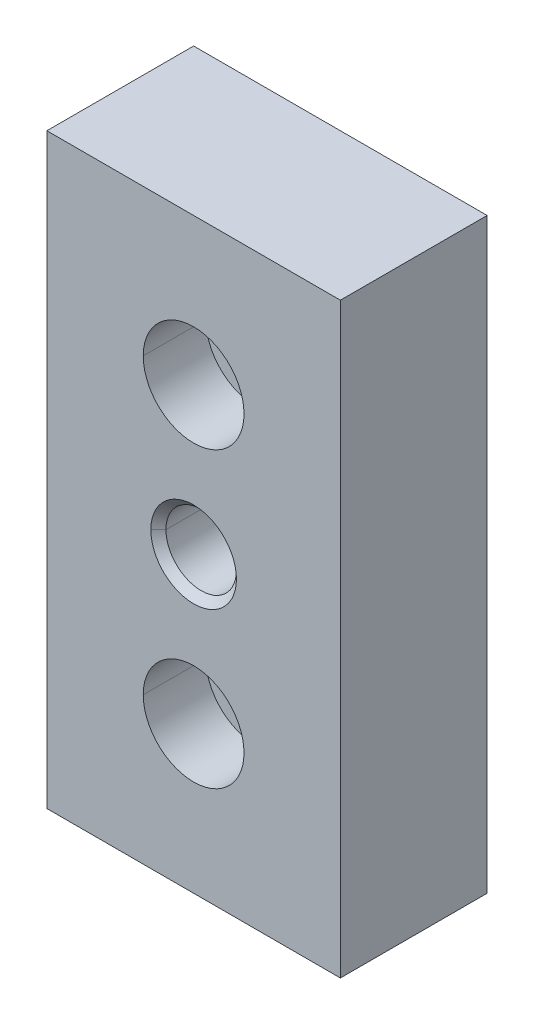
ISO-10303-21;
HEADER;
FILE_DESCRIPTION(('STEP AP214'),'2;1');
FILE_NAME('part.step','',(''),(''),'','','');
FILE_SCHEMA(('AUTOMOTIVE_DESIGN { 1 0 10303 214 1 1 1 1 }'));
ENDSEC;
DATA;
#1=APPLICATION_CONTEXT('core data for automotive mechanical design processes');
#2=APPLICATION_PROTOCOL_DEFINITION('international standard','automotive_design',2000,#1);
#3=PRODUCT_CONTEXT('',#1,'mechanical');
#4=PRODUCT('Part','Part','',(#3));
#5=PRODUCT_RELATED_PRODUCT_CATEGORY('part','',(#4));
#6=PRODUCT_DEFINITION_FORMATION('','',#4);
#7=PRODUCT_DEFINITION_CONTEXT('part definition',#1,'design');
#8=PRODUCT_DEFINITION('design','',#6,#7);
#9=PRODUCT_DEFINITION_SHAPE('','',#8);
#10=(LENGTH_UNIT() NAMED_UNIT(*) SI_UNIT(.MILLI.,.METRE.));
#11=(NAMED_UNIT(*) PLANE_ANGLE_UNIT() SI_UNIT($,.RADIAN.));
#12=(NAMED_UNIT(*) SI_UNIT($,.STERADIAN.) SOLID_ANGLE_UNIT());
#13=UNCERTAINTY_MEASURE_WITH_UNIT(LENGTH_MEASURE(1.E-05),#10,'distance_accuracy_value','');
#14=(GEOMETRIC_REPRESENTATION_CONTEXT(3) GLOBAL_UNCERTAINTY_ASSIGNED_CONTEXT((#13)) GLOBAL_UNIT_ASSIGNED_CONTEXT((#10,
#11,#12)) REPRESENTATION_CONTEXT('',''));
#15=CARTESIAN_POINT('',(0.,0.,0.));
#16=DIRECTION('',(0.,0.,1.));
#17=DIRECTION('',(1.,0.,0.));
#18=AXIS2_PLACEMENT_3D('',#15,#16,#17);
#19=CARTESIAN_POINT('',(19.05,-38.1,0.));
#20=DIRECTION('',(1.,0.,0.));
#21=DIRECTION('',(0.,0.,-1.));
#22=AXIS2_PLACEMENT_3D('',#19,#20,#21);
#23=PLANE('',#22);
#24=DIRECTION('',(0.,1.,0.));
#25=VECTOR('',#24,1.);
#26=CARTESIAN_POINT('',(19.05,-38.1,19.05));
#27=LINE('',#26,#25);
#28=CARTESIAN_POINT('',(19.05,-38.1,19.05));
#29=VERTEX_POINT('',#28);
#30=CARTESIAN_POINT('',(19.05,38.1,19.05));
#31=VERTEX_POINT('',#30);
#32=EDGE_CURVE('E10',#29,#31,#27,.T.);
#33=ORIENTED_EDGE('',*,*,#32,.F.);
#34=DIRECTION('',(0.,0.,1.));
#35=VECTOR('',#34,1.);
#36=CARTESIAN_POINT('',(19.05,-38.1,0.));
#37=LINE('',#36,#35);
#38=CARTESIAN_POINT('',(19.05,-38.1,0.));
#39=VERTEX_POINT('',#38);
#40=EDGE_CURVE('E24',#39,#29,#37,.T.);
#41=ORIENTED_EDGE('',*,*,#40,.F.);
#42=DIRECTION('',(0.,1.,0.));
#43=VECTOR('',#42,1.);
#44=CARTESIAN_POINT('',(19.05,-38.1,0.));
#45=LINE('',#44,#43);
#46=CARTESIAN_POINT('',(19.05,38.1,0.));
#47=VERTEX_POINT('',#46);
#48=EDGE_CURVE('E349',#39,#47,#45,.T.);
#49=ORIENTED_EDGE('',*,*,#48,.T.);
#50=DIRECTION('',(0.,0.,1.));
#51=VECTOR('',#50,1.);
#52=CARTESIAN_POINT('',(19.05,38.1,0.));
#53=LINE('',#52,#51);
#54=EDGE_CURVE('E345',#47,#31,#53,.T.);
#55=ORIENTED_EDGE('',*,*,#54,.T.);
#56=EDGE_LOOP('',(#33,#41,#49,#55));
#57=FACE_BOUND('',#56,.T.);
#58=ADVANCED_FACE('F16',(#57),#23,.T.);
#59=CARTESIAN_POINT('',(19.05,38.1,0.));
#60=DIRECTION('',(0.,1.,0.));
#61=DIRECTION('',(0.,0.,1.));
#62=AXIS2_PLACEMENT_3D('',#59,#60,#61);
#63=PLANE('',#62);
#64=DIRECTION('',(-1.,0.,0.));
#65=VECTOR('',#64,1.);
#66=CARTESIAN_POINT('',(19.05,38.1,19.05));
#67=LINE('',#66,#65);
#68=CARTESIAN_POINT('',(-19.05,38.1,19.05));
#69=VERTEX_POINT('',#68);
#70=EDGE_CURVE('E340',#31,#69,#67,.T.);
#71=ORIENTED_EDGE('',*,*,#70,.F.);
#72=ORIENTED_EDGE('',*,*,#54,.F.);
#73=DIRECTION('',(-1.,0.,0.));
#74=VECTOR('',#73,1.);
#75=CARTESIAN_POINT('',(19.05,38.1,0.));
#76=LINE('',#75,#74);
#77=CARTESIAN_POINT('',(-19.05,38.1,0.));
#78=VERTEX_POINT('',#77);
#79=EDGE_CURVE('E336',#47,#78,#76,.T.);
#80=ORIENTED_EDGE('',*,*,#79,.T.);
#81=DIRECTION('',(0.,0.,1.));
#82=VECTOR('',#81,1.);
#83=CARTESIAN_POINT('',(-19.05,38.1,0.));
#84=LINE('',#83,#82);
#85=EDGE_CURVE('E332',#78,#69,#84,.T.);
#86=ORIENTED_EDGE('',*,*,#85,.T.);
#87=EDGE_LOOP('',(#71,#72,#80,#86));
#88=FACE_BOUND('',#87,.T.);
#89=ADVANCED_FACE('F370',(#88),#63,.T.);
#90=CARTESIAN_POINT('',(-19.05,38.1,0.));
#91=DIRECTION('',(-1.,0.,0.));
#92=DIRECTION('',(0.,0.,1.));
#93=AXIS2_PLACEMENT_3D('',#90,#91,#92);
#94=PLANE('',#93);
#95=DIRECTION('',(0.,-1.,0.));
#96=VECTOR('',#95,1.);
#97=CARTESIAN_POINT('',(-19.05,38.1,19.05));
#98=LINE('',#97,#96);
#99=CARTESIAN_POINT('',(-19.05,-38.1,19.05));
#100=VERTEX_POINT('',#99);
#101=EDGE_CURVE('E327',#69,#100,#98,.T.);
#102=ORIENTED_EDGE('',*,*,#101,.F.);
#103=ORIENTED_EDGE('',*,*,#85,.F.);
#104=DIRECTION('',(0.,-1.,0.));
#105=VECTOR('',#104,1.);
#106=CARTESIAN_POINT('',(-19.05,38.1,0.));
#107=LINE('',#106,#105);
#108=CARTESIAN_POINT('',(-19.05,-38.1,0.));
#109=VERTEX_POINT('',#108);
#110=EDGE_CURVE('E323',#78,#109,#107,.T.);
#111=ORIENTED_EDGE('',*,*,#110,.T.);
#112=DIRECTION('',(0.,0.,1.));
#113=VECTOR('',#112,1.);
#114=CARTESIAN_POINT('',(-19.05,-38.1,0.));
#115=LINE('',#114,#113);
#116=EDGE_CURVE('E319',#109,#100,#115,.T.);
#117=ORIENTED_EDGE('',*,*,#116,.T.);
#118=EDGE_LOOP('',(#102,#103,#111,#117));
#119=FACE_BOUND('',#118,.T.);
#120=ADVANCED_FACE('F376',(#119),#94,.T.);
#121=CARTESIAN_POINT('',(-19.05,-38.1,0.));
#122=DIRECTION('',(0.,-1.,0.));
#123=DIRECTION('',(0.,0.,-1.));
#124=AXIS2_PLACEMENT_3D('',#121,#122,#123);
#125=PLANE('',#124);
#126=DIRECTION('',(1.,0.,0.));
#127=VECTOR('',#126,1.);
#128=CARTESIAN_POINT('',(-19.05,-38.1,19.05));
#129=LINE('',#128,#127);
#130=EDGE_CURVE('E315',#100,#29,#129,.T.);
#131=ORIENTED_EDGE('',*,*,#130,.F.);
#132=ORIENTED_EDGE('',*,*,#116,.F.);
#133=DIRECTION('',(1.,0.,0.));
#134=VECTOR('',#133,1.);
#135=CARTESIAN_POINT('',(-19.05,-38.1,0.));
#136=LINE('',#135,#134);
#137=EDGE_CURVE('E311',#109,#39,#136,.T.);
#138=ORIENTED_EDGE('',*,*,#137,.T.);
#139=ORIENTED_EDGE('',*,*,#40,.T.);
#140=EDGE_LOOP('',(#131,#132,#138,#139));
#141=FACE_BOUND('',#140,.T.);
#142=ADVANCED_FACE('F359',(#141),#125,.T.);
#143=CARTESIAN_POINT('',(0.,0.,0.));
#144=DIRECTION('',(0.,0.,1.));
#145=DIRECTION('',(1.,0.,0.));
#146=AXIS2_PLACEMENT_3D('',#143,#144,#145);
#147=PLANE('',#146);
#148=CARTESIAN_POINT('',(0.,19.05,0.));
#149=DIRECTION('',(0.,0.,1.));
#150=DIRECTION('',(1.,0.,0.));
#151=AXIS2_PLACEMENT_3D('',#148,#149,#150);
#152=CIRCLE('',#151,4.1656);
#153=CARTESIAN_POINT('',(4.1656,19.05,0.));
#154=VERTEX_POINT('',#153);
#155=CARTESIAN_POINT('',(-4.1656,19.05,0.));
#156=VERTEX_POINT('',#155);
#157=EDGE_CURVE('E138',#154,#156,#152,.T.);
#158=ORIENTED_EDGE('',*,*,#157,.T.);
#159=CARTESIAN_POINT('',(0.,19.05,0.));
#160=DIRECTION('',(0.,0.,1.));
#161=DIRECTION('',(1.,0.,0.));
#162=AXIS2_PLACEMENT_3D('',#159,#160,#161);
#163=CIRCLE('',#162,4.1656);
#164=EDGE_CURVE('E304',#156,#154,#163,.T.);
#165=ORIENTED_EDGE('',*,*,#164,.T.);
#166=EDGE_LOOP('',(#158,#165));
#167=FACE_BOUND('',#166,.T.);
#168=CARTESIAN_POINT('',(0.,-19.05,0.));
#169=DIRECTION('',(0.,0.,1.));
#170=DIRECTION('',(1.,0.,0.));
#171=AXIS2_PLACEMENT_3D('',#168,#169,#170);
#172=CIRCLE('',#171,4.1656);
#173=CARTESIAN_POINT('',(4.1656,-19.05,0.));
#174=VERTEX_POINT('',#173);
#175=CARTESIAN_POINT('',(-4.1656,-19.05,0.));
#176=VERTEX_POINT('',#175);
#177=EDGE_CURVE('E300',#174,#176,#172,.T.);
#178=ORIENTED_EDGE('',*,*,#177,.T.);
#179=CARTESIAN_POINT('',(0.,-19.05,0.));
#180=DIRECTION('',(0.,0.,1.));
#181=DIRECTION('',(1.,0.,0.));
#182=AXIS2_PLACEMENT_3D('',#179,#180,#181);
#183=CIRCLE('',#182,4.1656);
#184=EDGE_CURVE('E296',#176,#174,#183,.T.);
#185=ORIENTED_EDGE('',*,*,#184,.T.);
#186=EDGE_LOOP('',(#178,#185));
#187=FACE_BOUND('',#186,.T.);
#188=CARTESIAN_POINT('',(0.,0.,0.));
#189=DIRECTION('',(0.,0.,-1.));
#190=DIRECTION('',(-1.,0.,0.));
#191=AXIS2_PLACEMENT_3D('',#188,#189,#190);
#192=CIRCLE('',#191,5.55625);
#193=CARTESIAN_POINT('',(5.55625,0.,0.));
#194=VERTEX_POINT('',#193);
#195=CARTESIAN_POINT('',(-5.55625,0.,0.));
#196=VERTEX_POINT('',#195);
#197=EDGE_CURVE('E291',#194,#196,#192,.T.);
#198=ORIENTED_EDGE('',*,*,#197,.F.);
#199=CARTESIAN_POINT('',(0.,0.,0.));
#200=DIRECTION('',(0.,0.,-1.));
#201=DIRECTION('',(-1.,0.,0.));
#202=AXIS2_PLACEMENT_3D('',#199,#200,#201);
#203=CIRCLE('',#202,5.55625);
#204=EDGE_CURVE('E286',#196,#194,#203,.T.);
#205=ORIENTED_EDGE('',*,*,#204,.F.);
#206=EDGE_LOOP('',(#198,#205));
#207=FACE_BOUND('',#206,.T.);
#208=ORIENTED_EDGE('',*,*,#48,.F.);
#209=ORIENTED_EDGE('',*,*,#137,.F.);
#210=ORIENTED_EDGE('',*,*,#110,.F.);
#211=ORIENTED_EDGE('',*,*,#79,.F.);
#212=EDGE_LOOP('',(#208,#209,#210,#211));
#213=FACE_BOUND('',#212,.T.);
#214=ADVANCED_FACE('F366',(#167,#187,#207,#213),#147,.F.);
#215=CARTESIAN_POINT('',(0.,0.,0.98171));
#216=DIRECTION('',(0.,0.,-1.));
#217=DIRECTION('',(0.,-1.,0.));
#218=AXIS2_PLACEMENT_3D('',#215,#216,#217);
#219=CONICAL_SURFACE('',#218,4.57454,0.785398163397448);
#220=DIRECTION('',(0.707106781186547,0.,-0.707106781186548));
#221=VECTOR('',#220,1.);
#222=CARTESIAN_POINT('',(4.57454,0.,0.981710000000001));
#223=LINE('',#222,#221);
#224=CARTESIAN_POINT('',(4.57454,0.,0.98171));
#225=VERTEX_POINT('',#224);
#226=EDGE_CURVE('E281',#225,#194,#223,.T.);
#227=ORIENTED_EDGE('',*,*,#226,.F.);
#228=CARTESIAN_POINT('',(0.,0.,0.98171));
#229=DIRECTION('',(0.,0.,-1.));
#230=DIRECTION('',(-1.,0.,0.));
#231=AXIS2_PLACEMENT_3D('',#228,#229,#230);
#232=CIRCLE('',#231,4.57454);
#233=CARTESIAN_POINT('',(-4.57454,0.,0.98171));
#234=VERTEX_POINT('',#233);
#235=EDGE_CURVE('E276',#234,#225,#232,.T.);
#236=ORIENTED_EDGE('',*,*,#235,.F.);
#237=DIRECTION('',(-0.707106781186548,0.,-0.707106781186548));
#238=VECTOR('',#237,1.);
#239=CARTESIAN_POINT('',(-4.57454,0.,0.981710000000001));
#240=LINE('',#239,#238);
#241=EDGE_CURVE('E271',#234,#196,#240,.T.);
#242=ORIENTED_EDGE('',*,*,#241,.T.);
#243=ORIENTED_EDGE('',*,*,#204,.T.);
#244=EDGE_LOOP('',(#227,#236,#242,#243));
#245=FACE_BOUND('',#244,.T.);
#246=ADVANCED_FACE('F419',(#245),#219,.F.);
#247=CARTESIAN_POINT('',(0.,0.,0.98171));
#248=DIRECTION('',(0.,0.,-1.));
#249=DIRECTION('',(0.,1.,0.));
#250=AXIS2_PLACEMENT_3D('',#247,#248,#249);
#251=CONICAL_SURFACE('',#250,4.57454,0.785398163397448);
#252=ORIENTED_EDGE('',*,*,#226,.T.);
#253=ORIENTED_EDGE('',*,*,#197,.T.);
#254=ORIENTED_EDGE('',*,*,#241,.F.);
#255=CARTESIAN_POINT('',(0.,0.,0.98171));
#256=DIRECTION('',(0.,0.,-1.));
#257=DIRECTION('',(-1.,0.,0.));
#258=AXIS2_PLACEMENT_3D('',#255,#256,#257);
#259=CIRCLE('',#258,4.57454);
#260=EDGE_CURVE('E266',#225,#234,#259,.T.);
#261=ORIENTED_EDGE('',*,*,#260,.F.);
#262=EDGE_LOOP('',(#252,#253,#254,#261));
#263=FACE_BOUND('',#262,.T.);
#264=ADVANCED_FACE('F430',(#263),#251,.F.);
#265=CARTESIAN_POINT('',(0.,0.,0.));
#266=DIRECTION('',(0.,0.,-1.));
#267=DIRECTION('',(0.,1.,0.));
#268=AXIS2_PLACEMENT_3D('',#265,#266,#267);
#269=CYLINDRICAL_SURFACE('',#268,4.57454);
#270=DIRECTION('',(0.,0.,-1.));
#271=VECTOR('',#270,1.);
#272=CARTESIAN_POINT('',(4.57454,0.,18.06829));
#273=LINE('',#272,#271);
#274=CARTESIAN_POINT('',(4.57454,0.,18.06829));
#275=VERTEX_POINT('',#274);
#276=EDGE_CURVE('E261',#275,#225,#273,.T.);
#277=ORIENTED_EDGE('',*,*,#276,.T.);
#278=ORIENTED_EDGE('',*,*,#260,.T.);
#279=DIRECTION('',(0.,0.,-1.));
#280=VECTOR('',#279,1.);
#281=CARTESIAN_POINT('',(-4.57454,0.,18.06829));
#282=LINE('',#281,#280);
#283=CARTESIAN_POINT('',(-4.57454,0.,18.06829));
#284=VERTEX_POINT('',#283);
#285=EDGE_CURVE('E256',#284,#234,#282,.T.);
#286=ORIENTED_EDGE('',*,*,#285,.F.);
#287=CARTESIAN_POINT('',(0.,0.,18.06829));
#288=DIRECTION('',(0.,0.,-1.));
#289=DIRECTION('',(-1.,0.,0.));
#290=AXIS2_PLACEMENT_3D('',#287,#288,#289);
#291=CIRCLE('',#290,4.57454);
#292=EDGE_CURVE('E251',#275,#284,#291,.T.);
#293=ORIENTED_EDGE('',*,*,#292,.F.);
#294=EDGE_LOOP('',(#277,#278,#286,#293));
#295=FACE_BOUND('',#294,.T.);
#296=ADVANCED_FACE('F441',(#295),#269,.F.);
#297=CARTESIAN_POINT('',(0.,0.,19.05));
#298=DIRECTION('',(0.,0.,1.));
#299=DIRECTION('',(0.,1.,0.));
#300=AXIS2_PLACEMENT_3D('',#297,#298,#299);
#301=CONICAL_SURFACE('',#300,5.55625,0.785398163397448);
#302=DIRECTION('',(-0.707106781186548,0.,0.707106781186548));
#303=VECTOR('',#302,1.);
#304=CARTESIAN_POINT('',(-4.57454,0.,18.06829));
#305=LINE('',#304,#303);
#306=CARTESIAN_POINT('',(-5.55625,0.,19.05));
#307=VERTEX_POINT('',#306);
#308=EDGE_CURVE('E247',#284,#307,#305,.T.);
#309=ORIENTED_EDGE('',*,*,#308,.T.);
#310=CARTESIAN_POINT('',(0.,0.,19.05));
#311=DIRECTION('',(0.,0.,-1.));
#312=DIRECTION('',(-1.,0.,0.));
#313=AXIS2_PLACEMENT_3D('',#310,#311,#312);
#314=CIRCLE('',#313,5.55625);
#315=CARTESIAN_POINT('',(5.55625,0.,19.05));
#316=VERTEX_POINT('',#315);
#317=EDGE_CURVE('E242',#316,#307,#314,.T.);
#318=ORIENTED_EDGE('',*,*,#317,.F.);
#319=DIRECTION('',(0.707106781186548,0.,0.707106781186548));
#320=VECTOR('',#319,1.);
#321=CARTESIAN_POINT('',(4.57454,0.,18.06829));
#322=LINE('',#321,#320);
#323=EDGE_CURVE('E237',#275,#316,#322,.T.);
#324=ORIENTED_EDGE('',*,*,#323,.F.);
#325=ORIENTED_EDGE('',*,*,#292,.T.);
#326=EDGE_LOOP('',(#309,#318,#324,#325));
#327=FACE_BOUND('',#326,.T.);
#328=ADVANCED_FACE('F452',(#327),#301,.F.);
#329=CARTESIAN_POINT('',(0.,0.,19.05));
#330=DIRECTION('',(0.,0.,1.));
#331=DIRECTION('',(0.,-1.,0.));
#332=AXIS2_PLACEMENT_3D('',#329,#330,#331);
#333=CONICAL_SURFACE('',#332,5.55625,0.785398163397448);
#334=ORIENTED_EDGE('',*,*,#308,.F.);
#335=CARTESIAN_POINT('',(0.,0.,18.06829));
#336=DIRECTION('',(0.,0.,-1.));
#337=DIRECTION('',(-1.,0.,0.));
#338=AXIS2_PLACEMENT_3D('',#335,#336,#337);
#339=CIRCLE('',#338,4.57454);
#340=EDGE_CURVE('E232',#284,#275,#339,.T.);
#341=ORIENTED_EDGE('',*,*,#340,.T.);
#342=ORIENTED_EDGE('',*,*,#323,.T.);
#343=CARTESIAN_POINT('',(0.,0.,19.05));
#344=DIRECTION('',(0.,0.,-1.));
#345=DIRECTION('',(-1.,0.,0.));
#346=AXIS2_PLACEMENT_3D('',#343,#344,#345);
#347=CIRCLE('',#346,5.55625);
#348=EDGE_CURVE('E227',#307,#316,#347,.T.);
#349=ORIENTED_EDGE('',*,*,#348,.F.);
#350=EDGE_LOOP('',(#334,#341,#342,#349));
#351=FACE_BOUND('',#350,.T.);
#352=ADVANCED_FACE('F463',(#351),#333,.F.);
#353=CARTESIAN_POINT('',(0.,0.,19.05));
#354=DIRECTION('',(0.,0.,1.));
#355=DIRECTION('',(1.,0.,0.));
#356=AXIS2_PLACEMENT_3D('',#353,#354,#355);
#357=PLANE('',#356);
#358=CARTESIAN_POINT('',(0.,19.05,19.05));
#359=DIRECTION('',(0.,0.,1.));
#360=DIRECTION('',(1.,0.,0.));
#361=AXIS2_PLACEMENT_3D('',#358,#359,#360);
#362=CIRCLE('',#361,6.5405);
#363=CARTESIAN_POINT('',(-6.5405,19.05,19.05));
#364=VERTEX_POINT('',#363);
#365=CARTESIAN_POINT('',(6.5405,19.05,19.05));
#366=VERTEX_POINT('',#365);
#367=EDGE_CURVE('E222',#364,#366,#362,.T.);
#368=ORIENTED_EDGE('',*,*,#367,.F.);
#369=CARTESIAN_POINT('',(0.,19.05,19.05));
#370=DIRECTION('',(0.,0.,1.));
#371=DIRECTION('',(1.,0.,0.));
#372=AXIS2_PLACEMENT_3D('',#369,#370,#371);
#373=CIRCLE('',#372,6.5405);
#374=EDGE_CURVE('E217',#366,#364,#373,.T.);
#375=ORIENTED_EDGE('',*,*,#374,.F.);
#376=EDGE_LOOP('',(#368,#375));
#377=FACE_BOUND('',#376,.T.);
#378=CARTESIAN_POINT('',(0.,-19.05,19.05));
#379=DIRECTION('',(0.,0.,1.));
#380=DIRECTION('',(1.,0.,0.));
#381=AXIS2_PLACEMENT_3D('',#378,#379,#380);
#382=CIRCLE('',#381,6.5405);
#383=CARTESIAN_POINT('',(-6.5405,-19.05,19.05));
#384=VERTEX_POINT('',#383);
#385=CARTESIAN_POINT('',(6.5405,-19.05,19.05));
#386=VERTEX_POINT('',#385);
#387=EDGE_CURVE('E212',#384,#386,#382,.T.);
#388=ORIENTED_EDGE('',*,*,#387,.F.);
#389=CARTESIAN_POINT('',(0.,-19.05,19.05));
#390=DIRECTION('',(0.,0.,1.));
#391=DIRECTION('',(1.,0.,0.));
#392=AXIS2_PLACEMENT_3D('',#389,#390,#391);
#393=CIRCLE('',#392,6.5405);
#394=EDGE_CURVE('E207',#386,#384,#393,.T.);
#395=ORIENTED_EDGE('',*,*,#394,.F.);
#396=EDGE_LOOP('',(#388,#395));
#397=FACE_BOUND('',#396,.T.);
#398=ORIENTED_EDGE('',*,*,#348,.T.);
#399=ORIENTED_EDGE('',*,*,#317,.T.);
#400=EDGE_LOOP('',(#398,#399));
#401=FACE_BOUND('',#400,.T.);
#402=ORIENTED_EDGE('',*,*,#32,.T.);
#403=ORIENTED_EDGE('',*,*,#70,.T.);
#404=ORIENTED_EDGE('',*,*,#101,.T.);
#405=ORIENTED_EDGE('',*,*,#130,.T.);
#406=EDGE_LOOP('',(#402,#403,#404,#405));
#407=FACE_BOUND('',#406,.T.);
#408=ADVANCED_FACE('F374',(#377,#397,#401,#407),#357,.T.);
#409=CARTESIAN_POINT('',(0.,-19.05,19.05));
#410=DIRECTION('',(0.,0.,1.));
#411=DIRECTION('',(0.,-1.,0.));
#412=AXIS2_PLACEMENT_3D('',#409,#410,#411);
#413=CYLINDRICAL_SURFACE('',#412,6.5405);
#414=DIRECTION('',(0.,0.,1.));
#415=VECTOR('',#414,1.);
#416=CARTESIAN_POINT('',(-6.5405,-19.05,10.922));
#417=LINE('',#416,#415);
#418=CARTESIAN_POINT('',(-6.5405,-19.05,10.922));
#419=VERTEX_POINT('',#418);
#420=EDGE_CURVE('E202',#419,#384,#417,.T.);
#421=ORIENTED_EDGE('',*,*,#420,.F.);
#422=CARTESIAN_POINT('',(0.,-19.05,10.922));
#423=DIRECTION('',(0.,0.,1.));
#424=DIRECTION('',(1.,0.,0.));
#425=AXIS2_PLACEMENT_3D('',#422,#423,#424);
#426=CIRCLE('',#425,6.5405);
#427=CARTESIAN_POINT('',(6.5405,-19.05,10.922));
#428=VERTEX_POINT('',#427);
#429=EDGE_CURVE('E197',#428,#419,#426,.T.);
#430=ORIENTED_EDGE('',*,*,#429,.F.);
#431=DIRECTION('',(0.,0.,1.));
#432=VECTOR('',#431,1.);
#433=CARTESIAN_POINT('',(6.5405,-19.05,10.922));
#434=LINE('',#433,#432);
#435=EDGE_CURVE('E192',#428,#386,#434,.T.);
#436=ORIENTED_EDGE('',*,*,#435,.T.);
#437=ORIENTED_EDGE('',*,*,#394,.T.);
#438=EDGE_LOOP('',(#421,#430,#436,#437));
#439=FACE_BOUND('',#438,.T.);
#440=ADVANCED_FACE('F484',(#439),#413,.F.);
#441=CARTESIAN_POINT('',(0.,-19.05,19.05));
#442=DIRECTION('',(0.,0.,1.));
#443=DIRECTION('',(0.,1.,0.));
#444=AXIS2_PLACEMENT_3D('',#441,#442,#443);
#445=CYLINDRICAL_SURFACE('',#444,6.5405);
#446=ORIENTED_EDGE('',*,*,#420,.T.);
#447=ORIENTED_EDGE('',*,*,#387,.T.);
#448=ORIENTED_EDGE('',*,*,#435,.F.);
#449=CARTESIAN_POINT('',(0.,-19.05,10.922));
#450=DIRECTION('',(0.,0.,1.));
#451=DIRECTION('',(1.,0.,0.));
#452=AXIS2_PLACEMENT_3D('',#449,#450,#451);
#453=CIRCLE('',#452,6.5405);
#454=EDGE_CURVE('E187',#419,#428,#453,.T.);
#455=ORIENTED_EDGE('',*,*,#454,.F.);
#456=EDGE_LOOP('',(#446,#447,#448,#455));
#457=FACE_BOUND('',#456,.T.);
#458=ADVANCED_FACE('F495',(#457),#445,.F.);
#459=CARTESIAN_POINT('',(4.1656,-19.05,10.922));
#460=DIRECTION('',(0.,0.,1.));
#461=DIRECTION('',(1.,0.,0.));
#462=AXIS2_PLACEMENT_3D('',#459,#460,#461);
#463=PLANE('',#462);
#464=ORIENTED_EDGE('',*,*,#429,.T.);
#465=ORIENTED_EDGE('',*,*,#454,.T.);
#466=EDGE_LOOP('',(#464,#465));
#467=FACE_BOUND('',#466,.T.);
#468=CARTESIAN_POINT('',(0.,-19.05,10.922));
#469=DIRECTION('',(0.,0.,1.));
#470=DIRECTION('',(1.,0.,0.));
#471=AXIS2_PLACEMENT_3D('',#468,#469,#470);
#472=CIRCLE('',#471,4.1656);
#473=CARTESIAN_POINT('',(-4.1656,-19.05,10.922));
#474=VERTEX_POINT('',#473);
#475=CARTESIAN_POINT('',(4.1656,-19.05,10.922));
#476=VERTEX_POINT('',#475);
#477=EDGE_CURVE('E182',#474,#476,#472,.T.);
#478=ORIENTED_EDGE('',*,*,#477,.F.);
#479=CARTESIAN_POINT('',(0.,-19.05,10.922));
#480=DIRECTION('',(0.,0.,1.));
#481=DIRECTION('',(1.,0.,0.));
#482=AXIS2_PLACEMENT_3D('',#479,#480,#481);
#483=CIRCLE('',#482,4.1656);
#484=EDGE_CURVE('E177',#476,#474,#483,.T.);
#485=ORIENTED_EDGE('',*,*,#484,.F.);
#486=EDGE_LOOP('',(#478,#485));
#487=FACE_BOUND('',#486,.T.);
#488=ADVANCED_FACE('F506',(#467,#487),#463,.T.);
#489=CARTESIAN_POINT('',(0.,-19.05,19.05));
#490=DIRECTION('',(0.,0.,1.));
#491=DIRECTION('',(0.,-1.,0.));
#492=AXIS2_PLACEMENT_3D('',#489,#490,#491);
#493=CYLINDRICAL_SURFACE('',#492,4.1656);
#494=DIRECTION('',(0.,0.,1.));
#495=VECTOR('',#494,1.);
#496=CARTESIAN_POINT('',(-4.1656,-19.05,0.));
#497=LINE('',#496,#495);
#498=EDGE_CURVE('E172',#176,#474,#497,.T.);
#499=ORIENTED_EDGE('',*,*,#498,.F.);
#500=ORIENTED_EDGE('',*,*,#177,.F.);
#501=DIRECTION('',(0.,0.,1.));
#502=VECTOR('',#501,1.);
#503=CARTESIAN_POINT('',(4.1656,-19.05,0.));
#504=LINE('',#503,#502);
#505=EDGE_CURVE('E167',#174,#476,#504,.T.);
#506=ORIENTED_EDGE('',*,*,#505,.T.);
#507=ORIENTED_EDGE('',*,*,#484,.T.);
#508=EDGE_LOOP('',(#499,#500,#506,#507));
#509=FACE_BOUND('',#508,.T.);
#510=ADVANCED_FACE('F517',(#509),#493,.F.);
#511=CARTESIAN_POINT('',(0.,-19.05,19.05));
#512=DIRECTION('',(0.,0.,1.));
#513=DIRECTION('',(0.,1.,0.));
#514=AXIS2_PLACEMENT_3D('',#511,#512,#513);
#515=CYLINDRICAL_SURFACE('',#514,4.1656);
#516=ORIENTED_EDGE('',*,*,#498,.T.);
#517=ORIENTED_EDGE('',*,*,#477,.T.);
#518=ORIENTED_EDGE('',*,*,#505,.F.);
#519=ORIENTED_EDGE('',*,*,#184,.F.);
#520=EDGE_LOOP('',(#516,#517,#518,#519));
#521=FACE_BOUND('',#520,.T.);
#522=ADVANCED_FACE('F528',(#521),#515,.F.);
#523=CARTESIAN_POINT('',(0.,19.05,19.05));
#524=DIRECTION('',(0.,0.,1.));
#525=DIRECTION('',(0.,-1.,0.));
#526=AXIS2_PLACEMENT_3D('',#523,#524,#525);
#527=CYLINDRICAL_SURFACE('',#526,6.5405);
#528=DIRECTION('',(0.,0.,1.));
#529=VECTOR('',#528,1.);
#530=CARTESIAN_POINT('',(-6.5405,19.05,10.922));
#531=LINE('',#530,#529);
#532=CARTESIAN_POINT('',(-6.5405,19.05,10.922));
#533=VERTEX_POINT('',#532);
#534=EDGE_CURVE('E162',#533,#364,#531,.T.);
#535=ORIENTED_EDGE('',*,*,#534,.F.);
#536=CARTESIAN_POINT('',(0.,19.05,10.922));
#537=DIRECTION('',(0.,0.,1.));
#538=DIRECTION('',(1.,0.,0.));
#539=AXIS2_PLACEMENT_3D('',#536,#537,#538);
#540=CIRCLE('',#539,6.5405);
#541=CARTESIAN_POINT('',(6.5405,19.05,10.922));
#542=VERTEX_POINT('',#541);
#543=EDGE_CURVE('E157',#542,#533,#540,.T.);
#544=ORIENTED_EDGE('',*,*,#543,.F.);
#545=DIRECTION('',(0.,0.,1.));
#546=VECTOR('',#545,1.);
#547=CARTESIAN_POINT('',(6.5405,19.05,10.922));
#548=LINE('',#547,#546);
#549=EDGE_CURVE('E146',#542,#366,#548,.T.);
#550=ORIENTED_EDGE('',*,*,#549,.T.);
#551=ORIENTED_EDGE('',*,*,#374,.T.);
#552=EDGE_LOOP('',(#535,#544,#550,#551));
#553=FACE_BOUND('',#552,.T.);
#554=ADVANCED_FACE('F539',(#553),#527,.F.);
#555=CARTESIAN_POINT('',(0.,19.05,19.05));
#556=DIRECTION('',(0.,0.,1.));
#557=DIRECTION('',(0.,1.,0.));
#558=AXIS2_PLACEMENT_3D('',#555,#556,#557);
#559=CYLINDRICAL_SURFACE('',#558,6.5405);
#560=ORIENTED_EDGE('',*,*,#534,.T.);
#561=ORIENTED_EDGE('',*,*,#367,.T.);
#562=ORIENTED_EDGE('',*,*,#549,.F.);
#563=CARTESIAN_POINT('',(0.,19.05,10.922));
#564=DIRECTION('',(0.,0.,1.));
#565=DIRECTION('',(1.,0.,0.));
#566=AXIS2_PLACEMENT_3D('',#563,#564,#565);
#567=CIRCLE('',#566,6.5405);
#568=EDGE_CURVE('E143',#533,#542,#567,.T.);
#569=ORIENTED_EDGE('',*,*,#568,.F.);
#570=EDGE_LOOP('',(#560,#561,#562,#569));
#571=FACE_BOUND('',#570,.T.);
#572=ADVANCED_FACE('F550',(#571),#559,.F.);
#573=CARTESIAN_POINT('',(4.1656,19.05,10.922));
#574=DIRECTION('',(0.,0.,1.));
#575=DIRECTION('',(1.,0.,0.));
#576=AXIS2_PLACEMENT_3D('',#573,#574,#575);
#577=PLANE('',#576);
#578=ORIENTED_EDGE('',*,*,#543,.T.);
#579=ORIENTED_EDGE('',*,*,#568,.T.);
#580=EDGE_LOOP('',(#578,#579));
#581=FACE_BOUND('',#580,.T.);
#582=CARTESIAN_POINT('',(0.,19.05,10.922));
#583=DIRECTION('',(0.,0.,1.));
#584=DIRECTION('',(1.,0.,0.));
#585=AXIS2_PLACEMENT_3D('',#582,#583,#584);
#586=CIRCLE('',#585,4.1656);
#587=CARTESIAN_POINT('',(-4.1656,19.05,10.922));
#588=VERTEX_POINT('',#587);
#589=CARTESIAN_POINT('',(4.1656,19.05,10.922));
#590=VERTEX_POINT('',#589);
#591=EDGE_CURVE('E128',#588,#590,#586,.T.);
#592=ORIENTED_EDGE('',*,*,#591,.F.);
#593=CARTESIAN_POINT('',(0.,19.05,10.922));
#594=DIRECTION('',(0.,0.,1.));
#595=DIRECTION('',(1.,0.,0.));
#596=AXIS2_PLACEMENT_3D('',#593,#594,#595);
#597=CIRCLE('',#596,4.1656);
#598=EDGE_CURVE('E124',#590,#588,#597,.T.);
#599=ORIENTED_EDGE('',*,*,#598,.F.);
#600=EDGE_LOOP('',(#592,#599));
#601=FACE_BOUND('',#600,.T.);
#602=ADVANCED_FACE('F126',(#581,#601),#577,.T.);
#603=CARTESIAN_POINT('',(0.,19.05,19.05));
#604=DIRECTION('',(0.,0.,1.));
#605=DIRECTION('',(0.,-1.,0.));
#606=AXIS2_PLACEMENT_3D('',#603,#604,#605);
#607=CYLINDRICAL_SURFACE('',#606,4.1656);
#608=DIRECTION('',(0.,0.,1.));
#609=VECTOR('',#608,1.);
#610=CARTESIAN_POINT('',(-4.1656,19.05,0.));
#611=LINE('',#610,#609);
#612=EDGE_CURVE('E132',#156,#588,#611,.T.);
#613=ORIENTED_EDGE('',*,*,#612,.F.);
#614=ORIENTED_EDGE('',*,*,#157,.F.);
#615=DIRECTION('',(0.,0.,1.));
#616=VECTOR('',#615,1.);
#617=CARTESIAN_POINT('',(4.1656,19.05,0.));
#618=LINE('',#617,#616);
#619=EDGE_CURVE('E136',#154,#590,#618,.T.);
#620=ORIENTED_EDGE('',*,*,#619,.T.);
#621=ORIENTED_EDGE('',*,*,#598,.T.);
#622=EDGE_LOOP('',(#613,#614,#620,#621));
#623=FACE_BOUND('',#622,.T.);
#624=ADVANCED_FACE('F137',(#623),#607,.F.);
#625=CARTESIAN_POINT('',(0.,19.05,19.05));
#626=DIRECTION('',(0.,0.,1.));
#627=DIRECTION('',(0.,1.,0.));
#628=AXIS2_PLACEMENT_3D('',#625,#626,#627);
#629=CYLINDRICAL_SURFACE('',#628,4.1656);
#630=ORIENTED_EDGE('',*,*,#612,.T.);
#631=ORIENTED_EDGE('',*,*,#591,.T.);
#632=ORIENTED_EDGE('',*,*,#619,.F.);
#633=ORIENTED_EDGE('',*,*,#164,.F.);
#634=EDGE_LOOP('',(#630,#631,#632,#633));
#635=FACE_BOUND('',#634,.T.);
#636=ADVANCED_FACE('F142',(#635),#629,.F.);
#637=CARTESIAN_POINT('',(0.,0.,0.));
#638=DIRECTION('',(0.,0.,-1.));
#639=DIRECTION('',(-2.38000125333469E-10,-1.,0.));
#640=AXIS2_PLACEMENT_3D('',#637,#638,#639);
#641=CYLINDRICAL_SURFACE('',#640,4.57454);
#642=ORIENTED_EDGE('',*,*,#276,.F.);
#643=ORIENTED_EDGE('',*,*,#340,.F.);
#644=ORIENTED_EDGE('',*,*,#285,.T.);
#645=ORIENTED_EDGE('',*,*,#235,.T.);
#646=EDGE_LOOP('',(#642,#643,#644,#645));
#647=FACE_BOUND('',#646,.T.);
#648=ADVANCED_FACE('F590',(#647),#641,.F.);
#649=CLOSED_SHELL('',(#58,#89,#120,#142,#214,#246,#264,#296,#328,#352,#408,#440,#458,#488,#510,
#522,#554,#572,#602,#624,#636,#648));
#650=MANIFOLD_SOLID_BREP('B1',#649);
#651=ADVANCED_BREP_SHAPE_REPRESENTATION('',(#18,#650),#14);
#652=SHAPE_DEFINITION_REPRESENTATION(#9,#651);
ENDSEC;
END-ISO-10303-21;
